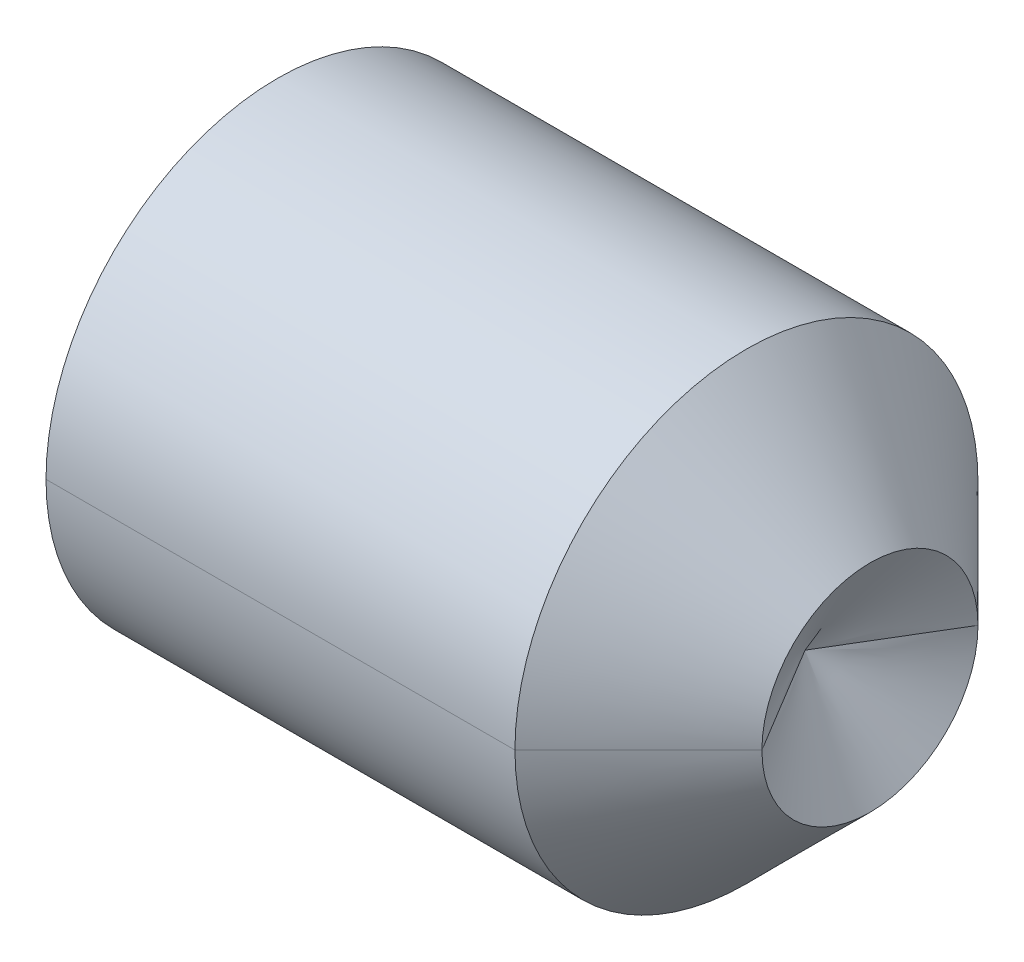
ISO-10303-21;
HEADER;
FILE_DESCRIPTION(('STEP AP214'),'2;1');
FILE_NAME('part.step','',(''),(''),'','','');
FILE_SCHEMA(('AUTOMOTIVE_DESIGN { 1 0 10303 214 1 1 1 1 }'));
ENDSEC;
DATA;
#1=APPLICATION_CONTEXT('core data for automotive mechanical design processes');
#2=APPLICATION_PROTOCOL_DEFINITION('international standard','automotive_design',2000,#1);
#3=PRODUCT_CONTEXT('',#1,'mechanical');
#4=PRODUCT('Part','Part','',(#3));
#5=PRODUCT_RELATED_PRODUCT_CATEGORY('part','',(#4));
#6=PRODUCT_DEFINITION_FORMATION('','',#4);
#7=PRODUCT_DEFINITION_CONTEXT('part definition',#1,'design');
#8=PRODUCT_DEFINITION('design','',#6,#7);
#9=PRODUCT_DEFINITION_SHAPE('','',#8);
#10=(LENGTH_UNIT() NAMED_UNIT(*) SI_UNIT(.MILLI.,.METRE.));
#11=(NAMED_UNIT(*) PLANE_ANGLE_UNIT() SI_UNIT($,.RADIAN.));
#12=(NAMED_UNIT(*) SI_UNIT($,.STERADIAN.) SOLID_ANGLE_UNIT());
#13=UNCERTAINTY_MEASURE_WITH_UNIT(LENGTH_MEASURE(1.E-05),#10,'distance_accuracy_value','');
#14=(GEOMETRIC_REPRESENTATION_CONTEXT(3) GLOBAL_UNCERTAINTY_ASSIGNED_CONTEXT((#13)) GLOBAL_UNIT_ASSIGNED_CONTEXT((#10,
#11,#12)) REPRESENTATION_CONTEXT('',''));
#15=CARTESIAN_POINT('',(0.,0.,0.));
#16=DIRECTION('',(0.,0.,1.));
#17=DIRECTION('',(1.,0.,0.));
#18=AXIS2_PLACEMENT_3D('',#15,#16,#17);
#19=CARTESIAN_POINT('',(2.1,-0.75,1.29903810567666));
#20=DIRECTION('',(1.,0.,0.));
#21=DIRECTION('',(0.,0.,1.));
#22=AXIS2_PLACEMENT_3D('',#19,#20,#21);
#23=PLANE('',#22);
#24=DIRECTION('',(0.,-0.866025403784439,0.5));
#25=VECTOR('',#24,1.);
#26=CARTESIAN_POINT('',(2.1,0.75,0.433012701892222));
#27=LINE('',#26,#25);
#28=CARTESIAN_POINT('',(2.1,0.75,0.433012701892222));
#29=VERTEX_POINT('',#28);
#30=CARTESIAN_POINT('',(2.1,0.,0.866025403784443));
#31=VERTEX_POINT('',#30);
#32=EDGE_CURVE('E211',#29,#31,#27,.T.);
#33=ORIENTED_EDGE('',*,*,#32,.F.);
#34=DIRECTION('',(0.,0.,-1.));
#35=VECTOR('',#34,1.);
#36=CARTESIAN_POINT('',(2.1,0.75,0.433012701892222));
#37=LINE('',#36,#35);
#38=CARTESIAN_POINT('',(2.1,0.75,-0.433012701892222));
#39=VERTEX_POINT('',#38);
#40=EDGE_CURVE('E11',#29,#39,#37,.T.);
#41=ORIENTED_EDGE('',*,*,#40,.T.);
#42=DIRECTION('',(0.,-0.866025403784439,-0.5));
#43=VECTOR('',#42,1.);
#44=CARTESIAN_POINT('',(2.1,0.75,-0.433012701892222));
#45=LINE('',#44,#43);
#46=CARTESIAN_POINT('',(2.1,0.,-0.866025403784436));
#47=VERTEX_POINT('',#46);
#48=EDGE_CURVE('E147',#39,#47,#45,.T.);
#49=ORIENTED_EDGE('',*,*,#48,.T.);
#50=DIRECTION('',(0.,0.866025403784438,-0.5));
#51=VECTOR('',#50,1.);
#52=CARTESIAN_POINT('',(2.1,-0.75,-0.433012701892218));
#53=LINE('',#52,#51);
#54=CARTESIAN_POINT('',(2.1,-0.75,-0.433012701892218));
#55=VERTEX_POINT('',#54);
#56=EDGE_CURVE('E145',#55,#47,#53,.T.);
#57=ORIENTED_EDGE('',*,*,#56,.F.);
#58=DIRECTION('',(0.,0.,-1.));
#59=VECTOR('',#58,1.);
#60=CARTESIAN_POINT('',(2.1,-0.75,0.433012701892225));
#61=LINE('',#60,#59);
#62=CARTESIAN_POINT('',(2.1,-0.75,0.433012701892225));
#63=VERTEX_POINT('',#62);
#64=EDGE_CURVE('E140',#63,#55,#61,.T.);
#65=ORIENTED_EDGE('',*,*,#64,.F.);
#66=DIRECTION('',(0.,0.866025403784439,0.5));
#67=VECTOR('',#66,1.);
#68=CARTESIAN_POINT('',(2.1,-0.75,0.433012701892225));
#69=LINE('',#68,#67);
#70=EDGE_CURVE('E167',#63,#31,#69,.T.);
#71=ORIENTED_EDGE('',*,*,#70,.T.);
#72=EDGE_LOOP('',(#33,#41,#49,#57,#65,#71));
#73=FACE_BOUND('',#72,.T.);
#74=ADVANCED_FACE('F16',(#73),#23,.F.);
#75=CARTESIAN_POINT('',(2.1,0.75,0.433012701892222));
#76=DIRECTION('',(0.,1.,0.));
#77=DIRECTION('',(0.,0.,-1.));
#78=AXIS2_PLACEMENT_3D('',#75,#76,#77);
#79=PLANE('',#78);
#80=DIRECTION('',(0.,0.,-1.));
#81=VECTOR('',#80,1.);
#82=CARTESIAN_POINT('',(0.,0.75,0.433012701892218));
#83=LINE('',#82,#81);
#84=CARTESIAN_POINT('',(0.,0.75,0.433012701892218));
#85=VERTEX_POINT('',#84);
#86=CARTESIAN_POINT('',(0.,0.75,-0.433012701892222));
#87=VERTEX_POINT('',#86);
#88=EDGE_CURVE('E250',#85,#87,#83,.T.);
#89=ORIENTED_EDGE('',*,*,#88,.T.);
#90=DIRECTION('',(-1.,0.,0.));
#91=VECTOR('',#90,1.);
#92=CARTESIAN_POINT('',(2.1,0.75,-0.433012701892222));
#93=LINE('',#92,#91);
#94=EDGE_CURVE('E27',#39,#87,#93,.T.);
#95=ORIENTED_EDGE('',*,*,#94,.F.);
#96=ORIENTED_EDGE('',*,*,#40,.F.);
#97=DIRECTION('',(-1.,0.,0.));
#98=VECTOR('',#97,1.);
#99=CARTESIAN_POINT('',(2.1,0.75,0.433012701892222));
#100=LINE('',#99,#98);
#101=EDGE_CURVE('E171',#29,#85,#100,.T.);
#102=ORIENTED_EDGE('',*,*,#101,.T.);
#103=EDGE_LOOP('',(#89,#95,#96,#102));
#104=FACE_BOUND('',#103,.T.);
#105=ADVANCED_FACE('F313',(#104),#79,.F.);
#106=CARTESIAN_POINT('',(2.1,0.75,-0.433012701892222));
#107=DIRECTION('',(0.,0.5,-0.866025403784439));
#108=DIRECTION('',(-1.,0.,0.));
#109=AXIS2_PLACEMENT_3D('',#106,#107,#108);
#110=PLANE('',#109);
#111=DIRECTION('',(0.,-0.866025403784439,-0.5));
#112=VECTOR('',#111,1.);
#113=CARTESIAN_POINT('',(0.,0.75,-0.433012701892222));
#114=LINE('',#113,#112);
#115=CARTESIAN_POINT('',(0.,0.,-0.866025403784443));
#116=VERTEX_POINT('',#115);
#117=EDGE_CURVE('E218',#87,#116,#114,.T.);
#118=ORIENTED_EDGE('',*,*,#117,.T.);
#119=DIRECTION('',(-1.,0.,0.));
#120=VECTOR('',#119,1.);
#121=CARTESIAN_POINT('',(2.1,0.,-0.866025403784436));
#122=LINE('',#121,#120);
#123=EDGE_CURVE('E151',#47,#116,#122,.T.);
#124=ORIENTED_EDGE('',*,*,#123,.F.);
#125=ORIENTED_EDGE('',*,*,#48,.F.);
#126=ORIENTED_EDGE('',*,*,#94,.T.);
#127=EDGE_LOOP('',(#118,#124,#125,#126));
#128=FACE_BOUND('',#127,.T.);
#129=ADVANCED_FACE('F317',(#128),#110,.F.);
#130=CARTESIAN_POINT('',(2.1,-0.75,-0.433012701892218));
#131=DIRECTION('',(0.,0.5,0.866025403784438));
#132=DIRECTION('',(1.,0.,0.));
#133=AXIS2_PLACEMENT_3D('',#130,#131,#132);
#134=PLANE('',#133);
#135=DIRECTION('',(0.,0.866025403784438,-0.5));
#136=VECTOR('',#135,1.);
#137=CARTESIAN_POINT('',(0.,-0.75,-0.433012701892218));
#138=LINE('',#137,#136);
#139=CARTESIAN_POINT('',(0.,-0.75,-0.433012701892218));
#140=VERTEX_POINT('',#139);
#141=EDGE_CURVE('E155',#140,#116,#138,.T.);
#142=ORIENTED_EDGE('',*,*,#141,.F.);
#143=DIRECTION('',(-1.,0.,0.));
#144=VECTOR('',#143,1.);
#145=CARTESIAN_POINT('',(2.1,-0.75,-0.433012701892218));
#146=LINE('',#145,#144);
#147=EDGE_CURVE('E62',#55,#140,#146,.T.);
#148=ORIENTED_EDGE('',*,*,#147,.F.);
#149=ORIENTED_EDGE('',*,*,#56,.T.);
#150=ORIENTED_EDGE('',*,*,#123,.T.);
#151=EDGE_LOOP('',(#142,#148,#149,#150));
#152=FACE_BOUND('',#151,.T.);
#153=ADVANCED_FACE('F153',(#152),#134,.T.);
#154=CARTESIAN_POINT('',(2.1,-0.75,0.433012701892225));
#155=DIRECTION('',(0.,1.,0.));
#156=DIRECTION('',(0.,0.,-1.));
#157=AXIS2_PLACEMENT_3D('',#154,#155,#156);
#158=PLANE('',#157);
#159=DIRECTION('',(0.,0.,-1.));
#160=VECTOR('',#159,1.);
#161=CARTESIAN_POINT('',(0.,-0.75,0.433012701892218));
#162=LINE('',#161,#160);
#163=CARTESIAN_POINT('',(0.,-0.75,0.433012701892218));
#164=VERTEX_POINT('',#163);
#165=EDGE_CURVE('E208',#164,#140,#162,.T.);
#166=ORIENTED_EDGE('',*,*,#165,.F.);
#167=DIRECTION('',(-1.,0.,0.));
#168=VECTOR('',#167,1.);
#169=CARTESIAN_POINT('',(2.1,-0.75,0.433012701892225));
#170=LINE('',#169,#168);
#171=EDGE_CURVE('E76',#63,#164,#170,.T.);
#172=ORIENTED_EDGE('',*,*,#171,.F.);
#173=ORIENTED_EDGE('',*,*,#64,.T.);
#174=ORIENTED_EDGE('',*,*,#147,.T.);
#175=EDGE_LOOP('',(#166,#172,#173,#174));
#176=FACE_BOUND('',#175,.T.);
#177=ADVANCED_FACE('F159',(#176),#158,.T.);
#178=CARTESIAN_POINT('',(2.1,-0.75,0.433012701892225));
#179=DIRECTION('',(0.,-0.5,0.866025403784439));
#180=DIRECTION('',(-1.,0.,0.));
#181=AXIS2_PLACEMENT_3D('',#178,#179,#180);
#182=PLANE('',#181);
#183=DIRECTION('',(0.,0.866025403784439,0.5));
#184=VECTOR('',#183,1.);
#185=CARTESIAN_POINT('',(0.,-0.75,0.433012701892218));
#186=LINE('',#185,#184);
#187=CARTESIAN_POINT('',(0.,0.,0.866025403784436));
#188=VERTEX_POINT('',#187);
#189=EDGE_CURVE('E209',#164,#188,#186,.T.);
#190=ORIENTED_EDGE('',*,*,#189,.T.);
#191=DIRECTION('',(-1.,0.,0.));
#192=VECTOR('',#191,1.);
#193=CARTESIAN_POINT('',(2.1,0.,0.866025403784443));
#194=LINE('',#193,#192);
#195=EDGE_CURVE('E214',#31,#188,#194,.T.);
#196=ORIENTED_EDGE('',*,*,#195,.F.);
#197=ORIENTED_EDGE('',*,*,#70,.F.);
#198=ORIENTED_EDGE('',*,*,#171,.T.);
#199=EDGE_LOOP('',(#190,#196,#197,#198));
#200=FACE_BOUND('',#199,.T.);
#201=ADVANCED_FACE('F266',(#200),#182,.F.);
#202=CARTESIAN_POINT('',(2.1,0.75,0.433012701892222));
#203=DIRECTION('',(0.,-0.5,-0.866025403784439));
#204=DIRECTION('',(0.,-0.866025403784439,0.5));
#205=AXIS2_PLACEMENT_3D('',#202,#203,#204);
#206=PLANE('',#205);
#207=DIRECTION('',(0.,-0.866025403784439,0.5));
#208=VECTOR('',#207,1.);
#209=CARTESIAN_POINT('',(0.,0.75,0.433012701892218));
#210=LINE('',#209,#208);
#211=EDGE_CURVE('E247',#85,#188,#210,.T.);
#212=ORIENTED_EDGE('',*,*,#211,.F.);
#213=ORIENTED_EDGE('',*,*,#101,.F.);
#214=ORIENTED_EDGE('',*,*,#32,.T.);
#215=ORIENTED_EDGE('',*,*,#195,.T.);
#216=EDGE_LOOP('',(#212,#213,#214,#215));
#217=FACE_BOUND('',#216,.T.);
#218=ADVANCED_FACE('F18',(#217),#206,.T.);
#219=CARTESIAN_POINT('',(1003.57939756668,0.,0.));
#220=DIRECTION('',(1.,0.,0.));
#221=DIRECTION('',(0.,0.,-1.));
#222=AXIS2_PLACEMENT_3D('',#219,#220,#221);
#223=CONICAL_SURFACE('',#222,1664.27948235053,1.02974425867666);
#224=DIRECTION('',(0.515038074910052,0.,0.857167300702114));
#225=VECTOR('',#224,1.);
#226=CARTESIAN_POINT('',(3.57939756668071,0.,0.));
#227=LINE('',#226,#225);
#228=CARTESIAN_POINT('',(3.57939756668071,0.,0.));
#229=VERTEX_POINT('',#228);
#230=CARTESIAN_POINT('',(4.,0.,0.700000000000008));
#231=VERTEX_POINT('',#230);
#232=EDGE_CURVE('E173',#229,#231,#227,.T.);
#233=ORIENTED_EDGE('',*,*,#232,.F.);
#234=DIRECTION('',(0.515038074910052,0.,-0.857167300702114));
#235=VECTOR('',#234,1.);
#236=CARTESIAN_POINT('',(3.57939756668071,0.,0.));
#237=LINE('',#236,#235);
#238=CARTESIAN_POINT('',(4.,0.,-0.7));
#239=VERTEX_POINT('',#238);
#240=EDGE_CURVE('E176',#229,#239,#237,.T.);
#241=ORIENTED_EDGE('',*,*,#240,.T.);
#242=CARTESIAN_POINT('',(4.,0.,0.));
#243=DIRECTION('',(-1.,0.,0.));
#244=DIRECTION('',(0.,0.,1.));
#245=AXIS2_PLACEMENT_3D('',#242,#243,#244);
#246=CIRCLE('',#245,0.7);
#247=EDGE_CURVE('E207',#231,#239,#246,.T.);
#248=ORIENTED_EDGE('',*,*,#247,.F.);
#249=EDGE_LOOP('',(#233,#241,#248));
#250=FACE_BOUND('',#249,.T.);
#251=ADVANCED_FACE('F326',(#250),#223,.F.);
#252=CARTESIAN_POINT('',(3.2,0.,0.));
#253=DIRECTION('',(-1.,0.,0.));
#254=DIRECTION('',(0.,0.,1.));
#255=AXIS2_PLACEMENT_3D('',#252,#253,#254);
#256=CONICAL_SURFACE('',#255,1.5,0.785398163397453);
#257=DIRECTION('',(-0.707106781186544,0.,-0.707106781186551));
#258=VECTOR('',#257,1.);
#259=CARTESIAN_POINT('',(3.2,0.,-1.5));
#260=LINE('',#259,#258);
#261=CARTESIAN_POINT('',(3.2,0.,-1.5));
#262=VERTEX_POINT('',#261);
#263=EDGE_CURVE('E105',#239,#262,#260,.T.);
#264=ORIENTED_EDGE('',*,*,#263,.F.);
#265=CARTESIAN_POINT('',(4.,0.,0.));
#266=DIRECTION('',(-1.,0.,0.));
#267=DIRECTION('',(0.,0.,1.));
#268=AXIS2_PLACEMENT_3D('',#265,#266,#267);
#269=CIRCLE('',#268,0.7);
#270=EDGE_CURVE('E175',#239,#231,#269,.T.);
#271=ORIENTED_EDGE('',*,*,#270,.T.);
#272=DIRECTION('',(-0.707106781186544,0.,0.707106781186551));
#273=VECTOR('',#272,1.);
#274=CARTESIAN_POINT('',(3.2,0.,1.5));
#275=LINE('',#274,#273);
#276=CARTESIAN_POINT('',(3.2,0.,1.5));
#277=VERTEX_POINT('',#276);
#278=EDGE_CURVE('E118',#231,#277,#275,.T.);
#279=ORIENTED_EDGE('',*,*,#278,.T.);
#280=CARTESIAN_POINT('',(3.2,0.,0.));
#281=DIRECTION('',(-1.,0.,0.));
#282=DIRECTION('',(0.,0.,1.));
#283=AXIS2_PLACEMENT_3D('',#280,#281,#282);
#284=CIRCLE('',#283,1.5);
#285=EDGE_CURVE('E224',#262,#277,#284,.T.);
#286=ORIENTED_EDGE('',*,*,#285,.F.);
#287=EDGE_LOOP('',(#264,#271,#279,#286));
#288=FACE_BOUND('',#287,.T.);
#289=ADVANCED_FACE('F290',(#288),#256,.T.);
#290=CARTESIAN_POINT('',(-12.7,0.,0.));
#291=DIRECTION('',(-1.,0.,0.));
#292=DIRECTION('',(0.,0.,1.));
#293=AXIS2_PLACEMENT_3D('',#290,#291,#292);
#294=CYLINDRICAL_SURFACE('',#293,1.5);
#295=DIRECTION('',(-1.,0.,0.));
#296=VECTOR('',#295,1.);
#297=CARTESIAN_POINT('',(-12.7,0.,-1.5));
#298=LINE('',#297,#296);
#299=CARTESIAN_POINT('',(0.161946750507691,0.,-1.5));
#300=VERTEX_POINT('',#299);
#301=EDGE_CURVE('E280',#262,#300,#298,.T.);
#302=ORIENTED_EDGE('',*,*,#301,.F.);
#303=ORIENTED_EDGE('',*,*,#285,.T.);
#304=DIRECTION('',(-1.,0.,0.));
#305=VECTOR('',#304,1.);
#306=CARTESIAN_POINT('',(-12.7,0.,1.5));
#307=LINE('',#306,#305);
#308=CARTESIAN_POINT('',(0.161946750507691,0.,1.5));
#309=VERTEX_POINT('',#308);
#310=EDGE_CURVE('E196',#277,#309,#307,.T.);
#311=ORIENTED_EDGE('',*,*,#310,.T.);
#312=CARTESIAN_POINT('',(0.161946750507691,0.,0.));
#313=DIRECTION('',(-1.,0.,0.));
#314=DIRECTION('',(0.,0.,1.));
#315=AXIS2_PLACEMENT_3D('',#312,#313,#314);
#316=CIRCLE('',#315,1.5);
#317=EDGE_CURVE('E222',#300,#309,#316,.T.);
#318=ORIENTED_EDGE('',*,*,#317,.F.);
#319=EDGE_LOOP('',(#302,#303,#311,#318));
#320=FACE_BOUND('',#319,.T.);
#321=ADVANCED_FACE('F296',(#320),#294,.T.);
#322=CARTESIAN_POINT('',(0.,0.,0.));
#323=DIRECTION('',(1.,0.,0.));
#324=DIRECTION('',(0.,0.,-1.));
#325=AXIS2_PLACEMENT_3D('',#322,#323,#324);
#326=CONICAL_SURFACE('',#325,1.2195,1.0471975511966);
#327=DIRECTION('',(0.5,0.,0.86602540378444));
#328=VECTOR('',#327,1.);
#329=CARTESIAN_POINT('',(0.,0.,1.2195));
#330=LINE('',#329,#328);
#331=CARTESIAN_POINT('',(0.,0.,1.2195));
#332=VERTEX_POINT('',#331);
#333=EDGE_CURVE('E177',#332,#309,#330,.T.);
#334=ORIENTED_EDGE('',*,*,#333,.F.);
#335=CARTESIAN_POINT('',(0.,0.,0.));
#336=DIRECTION('',(-1.,0.,0.));
#337=DIRECTION('',(0.,0.,1.));
#338=AXIS2_PLACEMENT_3D('',#335,#336,#337);
#339=CIRCLE('',#338,1.2195);
#340=CARTESIAN_POINT('',(0.,0.,-1.2195));
#341=VERTEX_POINT('',#340);
#342=EDGE_CURVE('E192',#341,#332,#339,.T.);
#343=ORIENTED_EDGE('',*,*,#342,.F.);
#344=DIRECTION('',(0.5,0.,-0.86602540378444));
#345=VECTOR('',#344,1.);
#346=CARTESIAN_POINT('',(0.,0.,-1.2195));
#347=LINE('',#346,#345);
#348=EDGE_CURVE('E180',#341,#300,#347,.T.);
#349=ORIENTED_EDGE('',*,*,#348,.T.);
#350=ORIENTED_EDGE('',*,*,#317,.T.);
#351=EDGE_LOOP('',(#334,#343,#349,#350));
#352=FACE_BOUND('',#351,.T.);
#353=ADVANCED_FACE('F300',(#352),#326,.T.);
#354=CARTESIAN_POINT('',(0.,0.,0.));
#355=DIRECTION('',(-1.,0.,0.));
#356=DIRECTION('',(0.,0.,1.));
#357=AXIS2_PLACEMENT_3D('',#354,#355,#356);
#358=PLANE('',#357);
#359=ORIENTED_EDGE('',*,*,#88,.F.);
#360=ORIENTED_EDGE('',*,*,#211,.T.);
#361=ORIENTED_EDGE('',*,*,#189,.F.);
#362=ORIENTED_EDGE('',*,*,#165,.T.);
#363=ORIENTED_EDGE('',*,*,#141,.T.);
#364=ORIENTED_EDGE('',*,*,#117,.F.);
#365=EDGE_LOOP('',(#359,#360,#361,#362,#363,#364));
#366=FACE_BOUND('',#365,.T.);
#367=ORIENTED_EDGE('',*,*,#342,.T.);
#368=CARTESIAN_POINT('',(0.,0.,0.));
#369=DIRECTION('',(-1.,0.,0.));
#370=DIRECTION('',(0.,0.,1.));
#371=AXIS2_PLACEMENT_3D('',#368,#369,#370);
#372=CIRCLE('',#371,1.2195);
#373=EDGE_CURVE('E181',#332,#341,#372,.T.);
#374=ORIENTED_EDGE('',*,*,#373,.T.);
#375=EDGE_LOOP('',(#367,#374));
#376=FACE_BOUND('',#375,.T.);
#377=ADVANCED_FACE('F268',(#366,#376),#358,.T.);
#378=CARTESIAN_POINT('',(0.,0.,0.));
#379=DIRECTION('',(1.,0.,0.));
#380=DIRECTION('',(0.,0.,-1.));
#381=AXIS2_PLACEMENT_3D('',#378,#379,#380);
#382=CONICAL_SURFACE('',#381,1.2195,1.0471975511966);
#383=ORIENTED_EDGE('',*,*,#373,.F.);
#384=ORIENTED_EDGE('',*,*,#333,.T.);
#385=CARTESIAN_POINT('',(0.161946750507691,0.,0.));
#386=DIRECTION('',(-1.,0.,0.));
#387=DIRECTION('',(0.,0.,1.));
#388=AXIS2_PLACEMENT_3D('',#385,#386,#387);
#389=CIRCLE('',#388,1.5);
#390=EDGE_CURVE('E20',#309,#300,#389,.T.);
#391=ORIENTED_EDGE('',*,*,#390,.T.);
#392=ORIENTED_EDGE('',*,*,#348,.F.);
#393=EDGE_LOOP('',(#383,#384,#391,#392));
#394=FACE_BOUND('',#393,.T.);
#395=ADVANCED_FACE('F301',(#394),#382,.T.);
#396=CARTESIAN_POINT('',(-12.7,0.,0.));
#397=DIRECTION('',(-1.,0.,0.));
#398=DIRECTION('',(0.,0.,1.));
#399=AXIS2_PLACEMENT_3D('',#396,#397,#398);
#400=CYLINDRICAL_SURFACE('',#399,1.5);
#401=CARTESIAN_POINT('',(3.2,0.,0.));
#402=DIRECTION('',(-1.,0.,0.));
#403=DIRECTION('',(0.,0.,1.));
#404=AXIS2_PLACEMENT_3D('',#401,#402,#403);
#405=CIRCLE('',#404,1.5);
#406=EDGE_CURVE('E240',#277,#262,#405,.T.);
#407=ORIENTED_EDGE('',*,*,#406,.T.);
#408=ORIENTED_EDGE('',*,*,#301,.T.);
#409=ORIENTED_EDGE('',*,*,#390,.F.);
#410=ORIENTED_EDGE('',*,*,#310,.F.);
#411=EDGE_LOOP('',(#407,#408,#409,#410));
#412=FACE_BOUND('',#411,.T.);
#413=ADVANCED_FACE('F294',(#412),#400,.T.);
#414=CARTESIAN_POINT('',(3.2,0.,0.));
#415=DIRECTION('',(-1.,0.,0.));
#416=DIRECTION('',(0.,0.,1.));
#417=AXIS2_PLACEMENT_3D('',#414,#415,#416);
#418=CONICAL_SURFACE('',#417,1.5,0.785398163397453);
#419=ORIENTED_EDGE('',*,*,#247,.T.);
#420=ORIENTED_EDGE('',*,*,#263,.T.);
#421=ORIENTED_EDGE('',*,*,#406,.F.);
#422=ORIENTED_EDGE('',*,*,#278,.F.);
#423=EDGE_LOOP('',(#419,#420,#421,#422));
#424=FACE_BOUND('',#423,.T.);
#425=ADVANCED_FACE('F292',(#424),#418,.T.);
#426=CARTESIAN_POINT('',(1003.57939756668,0.,0.));
#427=DIRECTION('',(1.,0.,0.));
#428=DIRECTION('',(0.,0.,-1.));
#429=AXIS2_PLACEMENT_3D('',#426,#427,#428);
#430=CONICAL_SURFACE('',#429,1664.27948235053,1.02974425867666);
#431=ORIENTED_EDGE('',*,*,#240,.F.);
#432=ORIENTED_EDGE('',*,*,#232,.T.);
#433=ORIENTED_EDGE('',*,*,#270,.F.);
#434=EDGE_LOOP('',(#431,#432,#433));
#435=FACE_BOUND('',#434,.T.);
#436=ADVANCED_FACE('F336',(#435),#430,.F.);
#437=CLOSED_SHELL('',(#74,#105,#129,#153,#177,#201,#218,#251,#289,#321,#353,#377,#395,#413,#425,#436));
#438=MANIFOLD_SOLID_BREP('B1',#437);
#439=ADVANCED_BREP_SHAPE_REPRESENTATION('',(#18,#438),#14);
#440=SHAPE_DEFINITION_REPRESENTATION(#9,#439);
ENDSEC;
END-ISO-10303-21;
